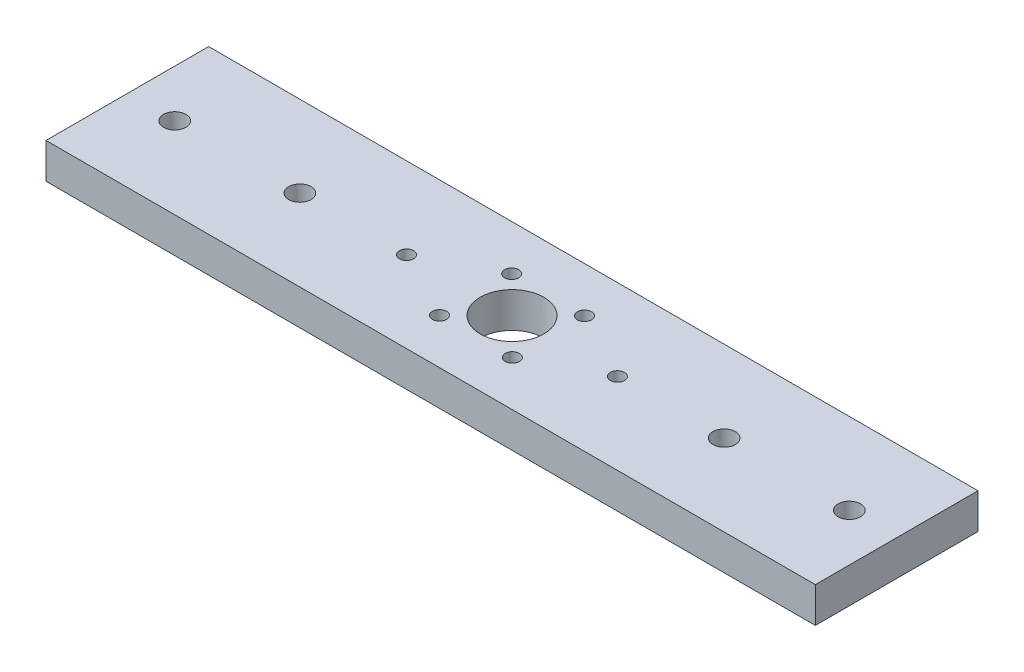
ISO-10303-21;
HEADER;
FILE_DESCRIPTION(('STEP AP214'),'2;1');
FILE_NAME('part.step','',(''),(''),'','','');
FILE_SCHEMA(('AUTOMOTIVE_DESIGN { 1 0 10303 214 1 1 1 1 }'));
ENDSEC;
DATA;
#1=APPLICATION_CONTEXT('core data for automotive mechanical design processes');
#2=APPLICATION_PROTOCOL_DEFINITION('international standard','automotive_design',2000,#1);
#3=PRODUCT_CONTEXT('',#1,'mechanical');
#4=PRODUCT('Part','Part','',(#3));
#5=PRODUCT_RELATED_PRODUCT_CATEGORY('part','',(#4));
#6=PRODUCT_DEFINITION_FORMATION('','',#4);
#7=PRODUCT_DEFINITION_CONTEXT('part definition',#1,'design');
#8=PRODUCT_DEFINITION('design','',#6,#7);
#9=PRODUCT_DEFINITION_SHAPE('','',#8);
#10=(LENGTH_UNIT() NAMED_UNIT(*) SI_UNIT(.MILLI.,.METRE.));
#11=(NAMED_UNIT(*) PLANE_ANGLE_UNIT() SI_UNIT($,.RADIAN.));
#12=(NAMED_UNIT(*) SI_UNIT($,.STERADIAN.) SOLID_ANGLE_UNIT());
#13=UNCERTAINTY_MEASURE_WITH_UNIT(LENGTH_MEASURE(1.E-05),#10,'distance_accuracy_value','');
#14=(GEOMETRIC_REPRESENTATION_CONTEXT(3) GLOBAL_UNCERTAINTY_ASSIGNED_CONTEXT((#13)) GLOBAL_UNIT_ASSIGNED_CONTEXT((#10,
#11,#12)) REPRESENTATION_CONTEXT('',''));
#15=CARTESIAN_POINT('',(0.,0.,0.));
#16=DIRECTION('',(0.,0.,1.));
#17=DIRECTION('',(1.,0.,0.));
#18=AXIS2_PLACEMENT_3D('',#15,#16,#17);
#19=CARTESIAN_POINT('',(0.,5.,0.));
#20=DIRECTION('',(1.,0.,0.));
#21=DIRECTION('',(0.,0.,-1.));
#22=AXIS2_PLACEMENT_3D('',#19,#20,#21);
#23=PLANE('',#22);
#24=DIRECTION('',(0.,0.,1.));
#25=VECTOR('',#24,1.);
#26=CARTESIAN_POINT('',(0.,0.,0.));
#27=LINE('',#26,#25);
#28=CARTESIAN_POINT('',(0.,0.,-23.));
#29=VERTEX_POINT('',#28);
#30=CARTESIAN_POINT('',(0.,0.,0.));
#31=VERTEX_POINT('',#30);
#32=EDGE_CURVE('E96',#29,#31,#27,.T.);
#33=ORIENTED_EDGE('',*,*,#32,.T.);
#34=DIRECTION('',(0.,-1.,0.));
#35=VECTOR('',#34,1.);
#36=CARTESIAN_POINT('',(0.,5.,0.));
#37=LINE('',#36,#35);
#38=CARTESIAN_POINT('',(0.,5.,0.));
#39=VERTEX_POINT('',#38);
#40=EDGE_CURVE('E11',#39,#31,#37,.T.);
#41=ORIENTED_EDGE('',*,*,#40,.F.);
#42=DIRECTION('',(0.,0.,1.));
#43=VECTOR('',#42,1.);
#44=CARTESIAN_POINT('',(0.,5.,0.));
#45=LINE('',#44,#43);
#46=CARTESIAN_POINT('',(0.,5.,-23.));
#47=VERTEX_POINT('',#46);
#48=EDGE_CURVE('E84',#47,#39,#45,.T.);
#49=ORIENTED_EDGE('',*,*,#48,.F.);
#50=DIRECTION('',(0.,-1.,0.));
#51=VECTOR('',#50,1.);
#52=CARTESIAN_POINT('',(0.,5.,-23.));
#53=LINE('',#52,#51);
#54=EDGE_CURVE('E92',#47,#29,#53,.T.);
#55=ORIENTED_EDGE('',*,*,#54,.T.);
#56=EDGE_LOOP('',(#33,#41,#49,#55));
#57=FACE_BOUND('',#56,.T.);
#58=ADVANCED_FACE('F33',(#57),#23,.F.);
#59=CARTESIAN_POINT('',(0.,5.,0.));
#60=DIRECTION('',(0.,0.,-1.));
#61=DIRECTION('',(-1.,0.,0.));
#62=AXIS2_PLACEMENT_3D('',#59,#60,#61);
#63=PLANE('',#62);
#64=DIRECTION('',(1.,0.,0.));
#65=VECTOR('',#64,1.);
#66=CARTESIAN_POINT('',(0.,0.,0.));
#67=LINE('',#66,#65);
#68=CARTESIAN_POINT('',(108.8,0.,0.));
#69=VERTEX_POINT('',#68);
#70=EDGE_CURVE('E88',#31,#69,#67,.T.);
#71=ORIENTED_EDGE('',*,*,#70,.T.);
#72=DIRECTION('',(0.,-1.,0.));
#73=VECTOR('',#72,1.);
#74=CARTESIAN_POINT('',(108.8,5.,0.));
#75=LINE('',#74,#73);
#76=CARTESIAN_POINT('',(108.8,5.,0.));
#77=VERTEX_POINT('',#76);
#78=EDGE_CURVE('E41',#77,#69,#75,.T.);
#79=ORIENTED_EDGE('',*,*,#78,.F.);
#80=DIRECTION('',(1.,0.,0.));
#81=VECTOR('',#80,1.);
#82=CARTESIAN_POINT('',(0.,5.,0.));
#83=LINE('',#82,#81);
#84=EDGE_CURVE('E79',#39,#77,#83,.T.);
#85=ORIENTED_EDGE('',*,*,#84,.F.);
#86=ORIENTED_EDGE('',*,*,#40,.T.);
#87=EDGE_LOOP('',(#71,#79,#85,#86));
#88=FACE_BOUND('',#87,.T.);
#89=ADVANCED_FACE('F87',(#88),#63,.F.);
#90=CARTESIAN_POINT('',(108.8,5.,0.));
#91=DIRECTION('',(-1.,0.,0.));
#92=DIRECTION('',(0.,0.,1.));
#93=AXIS2_PLACEMENT_3D('',#90,#91,#92);
#94=PLANE('',#93);
#95=DIRECTION('',(0.,0.,-1.));
#96=VECTOR('',#95,1.);
#97=CARTESIAN_POINT('',(108.8,0.,0.));
#98=LINE('',#97,#96);
#99=CARTESIAN_POINT('',(108.8,0.,-23.));
#100=VERTEX_POINT('',#99);
#101=EDGE_CURVE('E66',#69,#100,#98,.T.);
#102=ORIENTED_EDGE('',*,*,#101,.T.);
#103=DIRECTION('',(0.,-1.,0.));
#104=VECTOR('',#103,1.);
#105=CARTESIAN_POINT('',(108.8,5.,-23.));
#106=LINE('',#105,#104);
#107=CARTESIAN_POINT('',(108.8,5.,-23.));
#108=VERTEX_POINT('',#107);
#109=EDGE_CURVE('E89',#108,#100,#106,.T.);
#110=ORIENTED_EDGE('',*,*,#109,.F.);
#111=DIRECTION('',(0.,0.,-1.));
#112=VECTOR('',#111,1.);
#113=CARTESIAN_POINT('',(108.8,5.,0.));
#114=LINE('',#113,#112);
#115=EDGE_CURVE('E82',#77,#108,#114,.T.);
#116=ORIENTED_EDGE('',*,*,#115,.F.);
#117=ORIENTED_EDGE('',*,*,#78,.T.);
#118=EDGE_LOOP('',(#102,#110,#116,#117));
#119=FACE_BOUND('',#118,.T.);
#120=ADVANCED_FACE('F90',(#119),#94,.F.);
#121=CARTESIAN_POINT('',(0.,5.,-23.));
#122=DIRECTION('',(0.,0.,1.));
#123=DIRECTION('',(1.,0.,0.));
#124=AXIS2_PLACEMENT_3D('',#121,#122,#123);
#125=PLANE('',#124);
#126=DIRECTION('',(-1.,0.,0.));
#127=VECTOR('',#126,1.);
#128=CARTESIAN_POINT('',(0.,0.,-23.));
#129=LINE('',#128,#127);
#130=EDGE_CURVE('E72',#100,#29,#129,.T.);
#131=ORIENTED_EDGE('',*,*,#130,.T.);
#132=ORIENTED_EDGE('',*,*,#54,.F.);
#133=DIRECTION('',(-1.,0.,0.));
#134=VECTOR('',#133,1.);
#135=CARTESIAN_POINT('',(0.,5.,-23.));
#136=LINE('',#135,#134);
#137=EDGE_CURVE('E49',#108,#47,#136,.T.);
#138=ORIENTED_EDGE('',*,*,#137,.F.);
#139=ORIENTED_EDGE('',*,*,#109,.T.);
#140=EDGE_LOOP('',(#131,#132,#138,#139));
#141=FACE_BOUND('',#140,.T.);
#142=ADVANCED_FACE('F104',(#141),#125,.F.);
#143=CARTESIAN_POINT('',(0.,5.,0.));
#144=DIRECTION('',(0.,-1.,0.));
#145=DIRECTION('',(0.,0.,-1.));
#146=AXIS2_PLACEMENT_3D('',#143,#144,#145);
#147=PLANE('',#146);
#148=CARTESIAN_POINT('',(6.7,5.,-11.5));
#149=DIRECTION('',(0.,1.,0.));
#150=DIRECTION('',(0.,0.,1.));
#151=AXIS2_PLACEMENT_3D('',#148,#149,#150);
#152=CIRCLE('',#151,1.5875);
#153=CARTESIAN_POINT('',(6.7,5.,-9.9125));
#154=VERTEX_POINT('',#153);
#155=EDGE_CURVE('E168',#154,#154,#152,.T.);
#156=ORIENTED_EDGE('',*,*,#155,.F.);
#157=EDGE_LOOP('',(#156));
#158=FACE_BOUND('',#157,.T.);
#159=CARTESIAN_POINT('',(24.4,5.,-11.5));
#160=DIRECTION('',(0.,1.,0.));
#161=DIRECTION('',(0.,0.,1.));
#162=AXIS2_PLACEMENT_3D('',#159,#160,#161);
#163=CIRCLE('',#162,1.5875);
#164=CARTESIAN_POINT('',(24.4,5.,-9.9125));
#165=VERTEX_POINT('',#164);
#166=EDGE_CURVE('E162',#165,#165,#163,.T.);
#167=ORIENTED_EDGE('',*,*,#166,.F.);
#168=EDGE_LOOP('',(#167));
#169=FACE_BOUND('',#168,.T.);
#170=CARTESIAN_POINT('',(84.4,5.,-11.5));
#171=DIRECTION('',(0.,1.,0.));
#172=DIRECTION('',(0.,0.,1.));
#173=AXIS2_PLACEMENT_3D('',#170,#171,#172);
#174=CIRCLE('',#173,1.5875);
#175=CARTESIAN_POINT('',(84.4,5.,-9.9125));
#176=VERTEX_POINT('',#175);
#177=EDGE_CURVE('E155',#176,#176,#174,.T.);
#178=ORIENTED_EDGE('',*,*,#177,.F.);
#179=EDGE_LOOP('',(#178));
#180=FACE_BOUND('',#179,.T.);
#181=CARTESIAN_POINT('',(102.1,5.,-11.5));
#182=DIRECTION('',(0.,1.,0.));
#183=DIRECTION('',(0.,0.,1.));
#184=AXIS2_PLACEMENT_3D('',#181,#182,#183);
#185=CIRCLE('',#184,1.5875);
#186=CARTESIAN_POINT('',(102.1,5.,-9.9125));
#187=VERTEX_POINT('',#186);
#188=EDGE_CURVE('E156',#187,#187,#185,.T.);
#189=ORIENTED_EDGE('',*,*,#188,.F.);
#190=EDGE_LOOP('',(#189));
#191=FACE_BOUND('',#190,.T.);
#192=CARTESIAN_POINT('',(59.55,5.,-6.4));
#193=DIRECTION('',(0.,1.,0.));
#194=DIRECTION('',(0.,0.,1.));
#195=AXIS2_PLACEMENT_3D('',#192,#193,#194);
#196=CIRCLE('',#195,0.999999999999998);
#197=CARTESIAN_POINT('',(59.55,5.,-5.4));
#198=VERTEX_POINT('',#197);
#199=EDGE_CURVE('E133',#198,#198,#196,.T.);
#200=ORIENTED_EDGE('',*,*,#199,.F.);
#201=EDGE_LOOP('',(#200));
#202=FACE_BOUND('',#201,.T.);
#203=CARTESIAN_POINT('',(49.25,5.,-6.4));
#204=DIRECTION('',(0.,1.,0.));
#205=DIRECTION('',(0.,0.,1.));
#206=AXIS2_PLACEMENT_3D('',#203,#204,#205);
#207=CIRCLE('',#206,0.999999999999998);
#208=CARTESIAN_POINT('',(49.25,5.,-5.4));
#209=VERTEX_POINT('',#208);
#210=EDGE_CURVE('E127',#209,#209,#207,.T.);
#211=ORIENTED_EDGE('',*,*,#210,.F.);
#212=EDGE_LOOP('',(#211));
#213=FACE_BOUND('',#212,.T.);
#214=CARTESIAN_POINT('',(49.25,5.,-16.6));
#215=DIRECTION('',(0.,1.,0.));
#216=DIRECTION('',(0.,0.,1.));
#217=AXIS2_PLACEMENT_3D('',#214,#215,#216);
#218=CIRCLE('',#217,0.999999999999998);
#219=CARTESIAN_POINT('',(49.25,5.,-15.6));
#220=VERTEX_POINT('',#219);
#221=EDGE_CURVE('E119',#220,#220,#218,.T.);
#222=ORIENTED_EDGE('',*,*,#221,.F.);
#223=EDGE_LOOP('',(#222));
#224=FACE_BOUND('',#223,.T.);
#225=CARTESIAN_POINT('',(69.31,5.,-11.5));
#226=DIRECTION('',(0.,1.,0.));
#227=DIRECTION('',(0.,0.,1.));
#228=AXIS2_PLACEMENT_3D('',#225,#226,#227);
#229=CIRCLE('',#228,0.999999999999998);
#230=CARTESIAN_POINT('',(69.31,5.,-10.5));
#231=VERTEX_POINT('',#230);
#232=EDGE_CURVE('E120',#231,#231,#229,.T.);
#233=ORIENTED_EDGE('',*,*,#232,.F.);
#234=EDGE_LOOP('',(#233));
#235=FACE_BOUND('',#234,.T.);
#236=CARTESIAN_POINT('',(39.49,5.,-11.5));
#237=DIRECTION('',(0.,1.,0.));
#238=DIRECTION('',(0.,0.,1.));
#239=AXIS2_PLACEMENT_3D('',#236,#237,#238);
#240=CIRCLE('',#239,0.999999999999998);
#241=CARTESIAN_POINT('',(39.49,5.,-10.5));
#242=VERTEX_POINT('',#241);
#243=EDGE_CURVE('E143',#242,#242,#240,.T.);
#244=ORIENTED_EDGE('',*,*,#243,.F.);
#245=EDGE_LOOP('',(#244));
#246=FACE_BOUND('',#245,.T.);
#247=CARTESIAN_POINT('',(54.4,5.,-11.5));
#248=DIRECTION('',(0.,1.,0.));
#249=DIRECTION('',(0.,0.,1.));
#250=AXIS2_PLACEMENT_3D('',#247,#248,#249);
#251=CIRCLE('',#250,4.5);
#252=CARTESIAN_POINT('',(54.4,5.,-7.));
#253=VERTEX_POINT('',#252);
#254=EDGE_CURVE('E144',#253,#253,#251,.T.);
#255=ORIENTED_EDGE('',*,*,#254,.F.);
#256=EDGE_LOOP('',(#255));
#257=FACE_BOUND('',#256,.T.);
#258=CARTESIAN_POINT('',(59.55,5.,-16.6));
#259=DIRECTION('',(0.,1.,0.));
#260=DIRECTION('',(0.,0.,1.));
#261=AXIS2_PLACEMENT_3D('',#258,#259,#260);
#262=CIRCLE('',#261,0.999999999999998);
#263=CARTESIAN_POINT('',(59.55,5.,-15.6));
#264=VERTEX_POINT('',#263);
#265=EDGE_CURVE('E112',#264,#264,#262,.T.);
#266=ORIENTED_EDGE('',*,*,#265,.F.);
#267=EDGE_LOOP('',(#266));
#268=FACE_BOUND('',#267,.T.);
#269=ORIENTED_EDGE('',*,*,#48,.T.);
#270=ORIENTED_EDGE('',*,*,#84,.T.);
#271=ORIENTED_EDGE('',*,*,#115,.T.);
#272=ORIENTED_EDGE('',*,*,#137,.T.);
#273=EDGE_LOOP('',(#269,#270,#271,#272));
#274=FACE_BOUND('',#273,.T.);
#275=ADVANCED_FACE('F80',(#158,#169,#180,#191,#202,#213,#224,#235,#246,#257,#268,#274),#147,.F.);
#276=CARTESIAN_POINT('',(0.,0.,0.));
#277=DIRECTION('',(0.,-1.,0.));
#278=DIRECTION('',(0.,0.,-1.));
#279=AXIS2_PLACEMENT_3D('',#276,#277,#278);
#280=PLANE('',#279);
#281=CARTESIAN_POINT('',(6.7,0.,-11.5));
#282=DIRECTION('',(0.,-1.,0.));
#283=DIRECTION('',(0.,0.,-1.));
#284=AXIS2_PLACEMENT_3D('',#281,#282,#283);
#285=CIRCLE('',#284,1.5875);
#286=CARTESIAN_POINT('',(6.7,0.,-13.0875));
#287=VERTEX_POINT('',#286);
#288=EDGE_CURVE('E147',#287,#287,#285,.F.);
#289=ORIENTED_EDGE('',*,*,#288,.T.);
#290=EDGE_LOOP('',(#289));
#291=FACE_BOUND('',#290,.T.);
#292=CARTESIAN_POINT('',(24.4,0.,-11.5));
#293=DIRECTION('',(0.,-1.,0.));
#294=DIRECTION('',(0.,0.,-1.));
#295=AXIS2_PLACEMENT_3D('',#292,#293,#294);
#296=CIRCLE('',#295,1.5875);
#297=CARTESIAN_POINT('',(24.4,0.,-13.0875));
#298=VERTEX_POINT('',#297);
#299=EDGE_CURVE('E165',#298,#298,#296,.F.);
#300=ORIENTED_EDGE('',*,*,#299,.T.);
#301=EDGE_LOOP('',(#300));
#302=FACE_BOUND('',#301,.T.);
#303=CARTESIAN_POINT('',(84.4,0.,-11.5));
#304=DIRECTION('',(0.,-1.,0.));
#305=DIRECTION('',(0.,0.,-1.));
#306=AXIS2_PLACEMENT_3D('',#303,#304,#305);
#307=CIRCLE('',#306,1.5875);
#308=CARTESIAN_POINT('',(84.4,0.,-13.0875));
#309=VERTEX_POINT('',#308);
#310=EDGE_CURVE('E159',#309,#309,#307,.F.);
#311=ORIENTED_EDGE('',*,*,#310,.T.);
#312=EDGE_LOOP('',(#311));
#313=FACE_BOUND('',#312,.T.);
#314=CARTESIAN_POINT('',(102.1,0.,-11.5));
#315=DIRECTION('',(0.,-1.,0.));
#316=DIRECTION('',(0.,0.,-1.));
#317=AXIS2_PLACEMENT_3D('',#314,#315,#316);
#318=CIRCLE('',#317,1.5875);
#319=CARTESIAN_POINT('',(102.1,0.,-13.0875));
#320=VERTEX_POINT('',#319);
#321=EDGE_CURVE('E152',#320,#320,#318,.F.);
#322=ORIENTED_EDGE('',*,*,#321,.T.);
#323=EDGE_LOOP('',(#322));
#324=FACE_BOUND('',#323,.T.);
#325=CARTESIAN_POINT('',(59.55,0.,-6.4));
#326=DIRECTION('',(0.,-1.,0.));
#327=DIRECTION('',(0.,0.,-1.));
#328=AXIS2_PLACEMENT_3D('',#325,#326,#327);
#329=CIRCLE('',#328,0.999999999999998);
#330=CARTESIAN_POINT('',(59.55,0.,-7.4));
#331=VERTEX_POINT('',#330);
#332=EDGE_CURVE('E115',#331,#331,#329,.F.);
#333=ORIENTED_EDGE('',*,*,#332,.T.);
#334=EDGE_LOOP('',(#333));
#335=FACE_BOUND('',#334,.T.);
#336=CARTESIAN_POINT('',(49.25,0.,-6.4));
#337=DIRECTION('',(0.,-1.,0.));
#338=DIRECTION('',(0.,0.,-1.));
#339=AXIS2_PLACEMENT_3D('',#336,#337,#338);
#340=CIRCLE('',#339,0.999999999999998);
#341=CARTESIAN_POINT('',(49.25,0.,-7.4));
#342=VERTEX_POINT('',#341);
#343=EDGE_CURVE('E130',#342,#342,#340,.F.);
#344=ORIENTED_EDGE('',*,*,#343,.T.);
#345=EDGE_LOOP('',(#344));
#346=FACE_BOUND('',#345,.T.);
#347=CARTESIAN_POINT('',(49.25,0.,-16.6));
#348=DIRECTION('',(0.,-1.,0.));
#349=DIRECTION('',(0.,0.,-1.));
#350=AXIS2_PLACEMENT_3D('',#347,#348,#349);
#351=CIRCLE('',#350,0.999999999999998);
#352=CARTESIAN_POINT('',(49.25,0.,-17.6));
#353=VERTEX_POINT('',#352);
#354=EDGE_CURVE('E124',#353,#353,#351,.F.);
#355=ORIENTED_EDGE('',*,*,#354,.T.);
#356=EDGE_LOOP('',(#355));
#357=FACE_BOUND('',#356,.T.);
#358=CARTESIAN_POINT('',(69.31,0.,-11.5));
#359=DIRECTION('',(0.,-1.,0.));
#360=DIRECTION('',(0.,0.,-1.));
#361=AXIS2_PLACEMENT_3D('',#358,#359,#360);
#362=CIRCLE('',#361,0.999999999999998);
#363=CARTESIAN_POINT('',(69.31,0.,-12.5));
#364=VERTEX_POINT('',#363);
#365=EDGE_CURVE('E116',#364,#364,#362,.F.);
#366=ORIENTED_EDGE('',*,*,#365,.T.);
#367=EDGE_LOOP('',(#366));
#368=FACE_BOUND('',#367,.T.);
#369=CARTESIAN_POINT('',(39.49,0.,-11.5));
#370=DIRECTION('',(0.,-1.,0.));
#371=DIRECTION('',(0.,0.,-1.));
#372=AXIS2_PLACEMENT_3D('',#369,#370,#371);
#373=CIRCLE('',#372,0.999999999999998);
#374=CARTESIAN_POINT('',(39.49,0.,-12.5));
#375=VERTEX_POINT('',#374);
#376=EDGE_CURVE('E123',#375,#375,#373,.F.);
#377=ORIENTED_EDGE('',*,*,#376,.T.);
#378=EDGE_LOOP('',(#377));
#379=FACE_BOUND('',#378,.T.);
#380=CARTESIAN_POINT('',(54.4,0.,-11.5));
#381=DIRECTION('',(0.,-1.,0.));
#382=DIRECTION('',(0.,0.,-1.));
#383=AXIS2_PLACEMENT_3D('',#380,#381,#382);
#384=CIRCLE('',#383,4.5);
#385=CARTESIAN_POINT('',(54.4,0.,-16.));
#386=VERTEX_POINT('',#385);
#387=EDGE_CURVE('E140',#386,#386,#384,.F.);
#388=ORIENTED_EDGE('',*,*,#387,.T.);
#389=EDGE_LOOP('',(#388));
#390=FACE_BOUND('',#389,.T.);
#391=CARTESIAN_POINT('',(59.55,0.,-16.6));
#392=DIRECTION('',(0.,-1.,0.));
#393=DIRECTION('',(0.,0.,-1.));
#394=AXIS2_PLACEMENT_3D('',#391,#392,#393);
#395=CIRCLE('',#394,0.999999999999998);
#396=CARTESIAN_POINT('',(59.55,0.,-17.6));
#397=VERTEX_POINT('',#396);
#398=EDGE_CURVE('E99',#397,#397,#395,.F.);
#399=ORIENTED_EDGE('',*,*,#398,.T.);
#400=EDGE_LOOP('',(#399));
#401=FACE_BOUND('',#400,.T.);
#402=ORIENTED_EDGE('',*,*,#32,.F.);
#403=ORIENTED_EDGE('',*,*,#130,.F.);
#404=ORIENTED_EDGE('',*,*,#101,.F.);
#405=ORIENTED_EDGE('',*,*,#70,.F.);
#406=EDGE_LOOP('',(#402,#403,#404,#405));
#407=FACE_BOUND('',#406,.T.);
#408=ADVANCED_FACE('F107',(#291,#302,#313,#324,#335,#346,#357,#368,#379,#390,#401,#407),#280,.T.);
#409=CARTESIAN_POINT('',(59.55,-12.7279220613578,-16.6));
#410=DIRECTION('',(0.,1.,0.));
#411=DIRECTION('',(0.,0.,1.));
#412=AXIS2_PLACEMENT_3D('',#409,#410,#411);
#413=CYLINDRICAL_SURFACE('',#412,0.999999999999998);
#414=ORIENTED_EDGE('',*,*,#265,.T.);
#415=EDGE_LOOP('',(#414));
#416=FACE_BOUND('',#415,.T.);
#417=ORIENTED_EDGE('',*,*,#398,.F.);
#418=EDGE_LOOP('',(#417));
#419=FACE_BOUND('',#418,.T.);
#420=ADVANCED_FACE('F202',(#416,#419),#413,.F.);
#421=CARTESIAN_POINT('',(54.4,-12.7279220613578,-11.5));
#422=DIRECTION('',(0.,1.,0.));
#423=DIRECTION('',(0.,0.,1.));
#424=AXIS2_PLACEMENT_3D('',#421,#422,#423);
#425=CYLINDRICAL_SURFACE('',#424,4.5);
#426=ORIENTED_EDGE('',*,*,#254,.T.);
#427=EDGE_LOOP('',(#426));
#428=FACE_BOUND('',#427,.T.);
#429=ORIENTED_EDGE('',*,*,#387,.F.);
#430=EDGE_LOOP('',(#429));
#431=FACE_BOUND('',#430,.T.);
#432=ADVANCED_FACE('F205',(#428,#431),#425,.F.);
#433=CARTESIAN_POINT('',(39.49,-12.7279220613578,-11.5));
#434=DIRECTION('',(0.,1.,0.));
#435=DIRECTION('',(0.,0.,1.));
#436=AXIS2_PLACEMENT_3D('',#433,#434,#435);
#437=CYLINDRICAL_SURFACE('',#436,0.999999999999998);
#438=ORIENTED_EDGE('',*,*,#243,.T.);
#439=EDGE_LOOP('',(#438));
#440=FACE_BOUND('',#439,.T.);
#441=ORIENTED_EDGE('',*,*,#376,.F.);
#442=EDGE_LOOP('',(#441));
#443=FACE_BOUND('',#442,.T.);
#444=ADVANCED_FACE('F288',(#440,#443),#437,.F.);
#445=CARTESIAN_POINT('',(69.31,-12.7279220613578,-11.5));
#446=DIRECTION('',(0.,1.,0.));
#447=DIRECTION('',(0.,0.,1.));
#448=AXIS2_PLACEMENT_3D('',#445,#446,#447);
#449=CYLINDRICAL_SURFACE('',#448,0.999999999999998);
#450=ORIENTED_EDGE('',*,*,#232,.T.);
#451=EDGE_LOOP('',(#450));
#452=FACE_BOUND('',#451,.T.);
#453=ORIENTED_EDGE('',*,*,#365,.F.);
#454=EDGE_LOOP('',(#453));
#455=FACE_BOUND('',#454,.T.);
#456=ADVANCED_FACE('F291',(#452,#455),#449,.F.);
#457=CARTESIAN_POINT('',(49.25,-12.7279220613578,-16.6));
#458=DIRECTION('',(0.,1.,0.));
#459=DIRECTION('',(0.,0.,1.));
#460=AXIS2_PLACEMENT_3D('',#457,#458,#459);
#461=CYLINDRICAL_SURFACE('',#460,0.999999999999998);
#462=ORIENTED_EDGE('',*,*,#221,.T.);
#463=EDGE_LOOP('',(#462));
#464=FACE_BOUND('',#463,.T.);
#465=ORIENTED_EDGE('',*,*,#354,.F.);
#466=EDGE_LOOP('',(#465));
#467=FACE_BOUND('',#466,.T.);
#468=ADVANCED_FACE('F301',(#464,#467),#461,.F.);
#469=CARTESIAN_POINT('',(49.25,-12.7279220613578,-6.4));
#470=DIRECTION('',(0.,1.,0.));
#471=DIRECTION('',(0.,0.,1.));
#472=AXIS2_PLACEMENT_3D('',#469,#470,#471);
#473=CYLINDRICAL_SURFACE('',#472,0.999999999999998);
#474=ORIENTED_EDGE('',*,*,#210,.T.);
#475=EDGE_LOOP('',(#474));
#476=FACE_BOUND('',#475,.T.);
#477=ORIENTED_EDGE('',*,*,#343,.F.);
#478=EDGE_LOOP('',(#477));
#479=FACE_BOUND('',#478,.T.);
#480=ADVANCED_FACE('F297',(#476,#479),#473,.F.);
#481=CARTESIAN_POINT('',(59.55,-12.7279220613578,-6.4));
#482=DIRECTION('',(0.,1.,0.));
#483=DIRECTION('',(0.,0.,1.));
#484=AXIS2_PLACEMENT_3D('',#481,#482,#483);
#485=CYLINDRICAL_SURFACE('',#484,0.999999999999998);
#486=ORIENTED_EDGE('',*,*,#199,.T.);
#487=EDGE_LOOP('',(#486));
#488=FACE_BOUND('',#487,.T.);
#489=ORIENTED_EDGE('',*,*,#332,.F.);
#490=EDGE_LOOP('',(#489));
#491=FACE_BOUND('',#490,.T.);
#492=ADVANCED_FACE('F240',(#488,#491),#485,.F.);
#493=CARTESIAN_POINT('',(102.1,-4.49012806053458,-11.5));
#494=DIRECTION('',(0.,1.,0.));
#495=DIRECTION('',(0.,0.,1.));
#496=AXIS2_PLACEMENT_3D('',#493,#494,#495);
#497=CYLINDRICAL_SURFACE('',#496,1.5875);
#498=ORIENTED_EDGE('',*,*,#188,.T.);
#499=EDGE_LOOP('',(#498));
#500=FACE_BOUND('',#499,.T.);
#501=ORIENTED_EDGE('',*,*,#321,.F.);
#502=EDGE_LOOP('',(#501));
#503=FACE_BOUND('',#502,.T.);
#504=ADVANCED_FACE('F250',(#500,#503),#497,.F.);
#505=CARTESIAN_POINT('',(84.4,-4.49012806053458,-11.5));
#506=DIRECTION('',(0.,1.,0.));
#507=DIRECTION('',(0.,0.,1.));
#508=AXIS2_PLACEMENT_3D('',#505,#506,#507);
#509=CYLINDRICAL_SURFACE('',#508,1.5875);
#510=ORIENTED_EDGE('',*,*,#177,.T.);
#511=EDGE_LOOP('',(#510));
#512=FACE_BOUND('',#511,.T.);
#513=ORIENTED_EDGE('',*,*,#310,.F.);
#514=EDGE_LOOP('',(#513));
#515=FACE_BOUND('',#514,.T.);
#516=ADVANCED_FACE('F255',(#512,#515),#509,.F.);
#517=CARTESIAN_POINT('',(24.4,-4.49012806053458,-11.5));
#518=DIRECTION('',(0.,1.,0.));
#519=DIRECTION('',(0.,0.,1.));
#520=AXIS2_PLACEMENT_3D('',#517,#518,#519);
#521=CYLINDRICAL_SURFACE('',#520,1.5875);
#522=ORIENTED_EDGE('',*,*,#166,.T.);
#523=EDGE_LOOP('',(#522));
#524=FACE_BOUND('',#523,.T.);
#525=ORIENTED_EDGE('',*,*,#299,.F.);
#526=EDGE_LOOP('',(#525));
#527=FACE_BOUND('',#526,.T.);
#528=ADVANCED_FACE('F265',(#524,#527),#521,.F.);
#529=CARTESIAN_POINT('',(6.7,-4.49012806053458,-11.5));
#530=DIRECTION('',(0.,1.,0.));
#531=DIRECTION('',(0.,0.,1.));
#532=AXIS2_PLACEMENT_3D('',#529,#530,#531);
#533=CYLINDRICAL_SURFACE('',#532,1.5875);
#534=ORIENTED_EDGE('',*,*,#155,.T.);
#535=EDGE_LOOP('',(#534));
#536=FACE_BOUND('',#535,.T.);
#537=ORIENTED_EDGE('',*,*,#288,.F.);
#538=EDGE_LOOP('',(#537));
#539=FACE_BOUND('',#538,.T.);
#540=ADVANCED_FACE('F176',(#536,#539),#533,.F.);
#541=CLOSED_SHELL('',(#58,#89,#120,#142,#275,#408,#420,#432,#444,#456,#468,#480,#492,#504,#516,
#528,#540));
#542=MANIFOLD_SOLID_BREP('B2',#541);
#543=ADVANCED_BREP_SHAPE_REPRESENTATION('',(#18,#542),#14);
#544=SHAPE_DEFINITION_REPRESENTATION(#9,#543);
ENDSEC;
END-ISO-10303-21;
